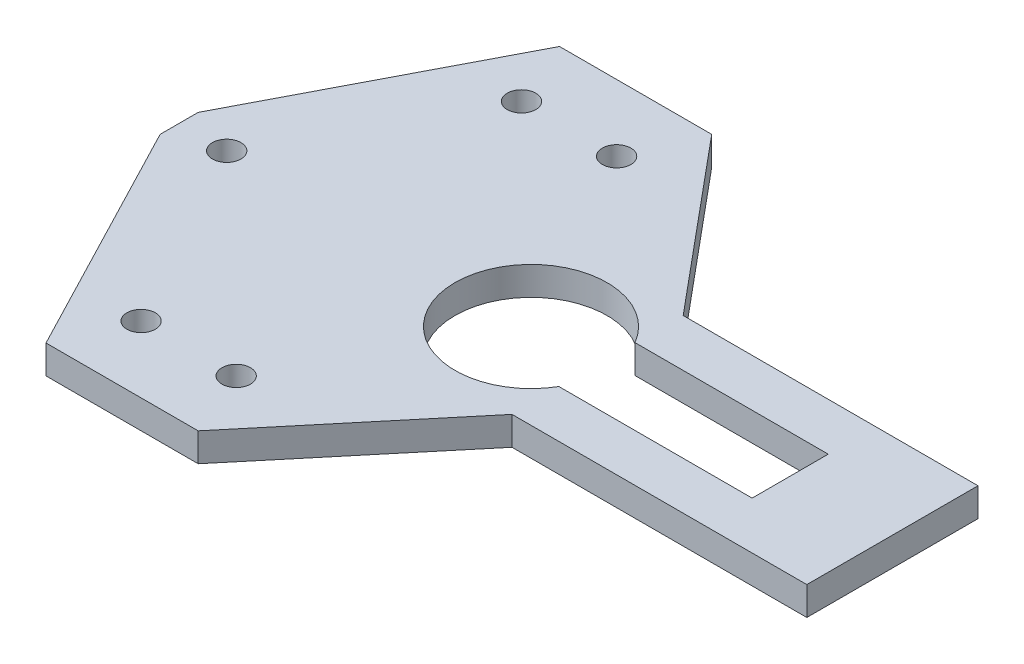
ISO-10303-21;
HEADER;
FILE_DESCRIPTION(('STEP AP214'),'2;1');
FILE_NAME('part.step','',(''),(''),'','','');
FILE_SCHEMA(('AUTOMOTIVE_DESIGN { 1 0 10303 214 1 1 1 1 }'));
ENDSEC;
DATA;
#1=APPLICATION_CONTEXT('core data for automotive mechanical design processes');
#2=APPLICATION_PROTOCOL_DEFINITION('international standard','automotive_design',2000,#1);
#3=PRODUCT_CONTEXT('',#1,'mechanical');
#4=PRODUCT('Part','Part','',(#3));
#5=PRODUCT_RELATED_PRODUCT_CATEGORY('part','',(#4));
#6=PRODUCT_DEFINITION_FORMATION('','',#4);
#7=PRODUCT_DEFINITION_CONTEXT('part definition',#1,'design');
#8=PRODUCT_DEFINITION('design','',#6,#7);
#9=PRODUCT_DEFINITION_SHAPE('','',#8);
#10=(LENGTH_UNIT() NAMED_UNIT(*) SI_UNIT(.MILLI.,.METRE.));
#11=(NAMED_UNIT(*) PLANE_ANGLE_UNIT() SI_UNIT($,.RADIAN.));
#12=(NAMED_UNIT(*) SI_UNIT($,.STERADIAN.) SOLID_ANGLE_UNIT());
#13=UNCERTAINTY_MEASURE_WITH_UNIT(LENGTH_MEASURE(1.E-05),#10,'distance_accuracy_value','');
#14=(GEOMETRIC_REPRESENTATION_CONTEXT(3) GLOBAL_UNCERTAINTY_ASSIGNED_CONTEXT((#13)) GLOBAL_UNIT_ASSIGNED_CONTEXT((#10,
#11,#12)) REPRESENTATION_CONTEXT('',''));
#15=CARTESIAN_POINT('',(0.,0.,0.));
#16=DIRECTION('',(0.,0.,1.));
#17=DIRECTION('',(1.,0.,0.));
#18=AXIS2_PLACEMENT_3D('',#15,#16,#17);
#19=CARTESIAN_POINT('',(0.,3.,0.));
#20=DIRECTION('',(0.,1.,0.));
#21=DIRECTION('',(0.,0.,1.));
#22=AXIS2_PLACEMENT_3D('',#19,#20,#21);
#23=PLANE('',#22);
#24=CARTESIAN_POINT('',(-21.,3.,20.));
#25=DIRECTION('',(0.,1.,0.));
#26=DIRECTION('',(0.,0.,-1.));
#27=AXIS2_PLACEMENT_3D('',#24,#25,#26);
#28=CIRCLE('',#27,1.5);
#29=CARTESIAN_POINT('',(-21.,3.,18.5));
#30=VERTEX_POINT('',#29);
#31=EDGE_CURVE('E533',#30,#30,#28,.T.);
#32=ORIENTED_EDGE('',*,*,#31,.F.);
#33=EDGE_LOOP('',(#32));
#34=FACE_BOUND('',#33,.T.);
#35=CARTESIAN_POINT('',(-11.,3.,-20.));
#36=DIRECTION('',(0.,1.,0.));
#37=DIRECTION('',(0.,0.,1.));
#38=AXIS2_PLACEMENT_3D('',#35,#36,#37);
#39=CIRCLE('',#38,1.5);
#40=CARTESIAN_POINT('',(-11.,3.,-18.5));
#41=VERTEX_POINT('',#40);
#42=EDGE_CURVE('E549',#41,#41,#39,.T.);
#43=ORIENTED_EDGE('',*,*,#42,.F.);
#44=EDGE_LOOP('',(#43));
#45=FACE_BOUND('',#44,.T.);
#46=DIRECTION('',(0.,0.,-1.));
#47=VECTOR('',#46,1.);
#48=CARTESIAN_POINT('',(27.25,3.,-4.));
#49=LINE('',#48,#47);
#50=CARTESIAN_POINT('',(27.25,3.,4.));
#51=VERTEX_POINT('',#50);
#52=CARTESIAN_POINT('',(27.25,3.,-4.));
#53=VERTEX_POINT('',#52);
#54=EDGE_CURVE('E150',#51,#53,#49,.T.);
#55=ORIENTED_EDGE('',*,*,#54,.F.);
#56=DIRECTION('',(1.,0.,0.));
#57=VECTOR('',#56,1.);
#58=CARTESIAN_POINT('',(6.92820323027551,3.,4.));
#59=LINE('',#58,#57);
#60=CARTESIAN_POINT('',(6.92820323027551,3.,4.));
#61=VERTEX_POINT('',#60);
#62=EDGE_CURVE('E141',#61,#51,#59,.T.);
#63=ORIENTED_EDGE('',*,*,#62,.F.);
#64=CARTESIAN_POINT('',(0.,3.,0.));
#65=DIRECTION('',(0.,1.,0.));
#66=DIRECTION('',(0.,0.,1.));
#67=AXIS2_PLACEMENT_3D('',#64,#65,#66);
#68=CIRCLE('',#67,8.);
#69=CARTESIAN_POINT('',(6.92820323027551,3.,-4.));
#70=VERTEX_POINT('',#69);
#71=EDGE_CURVE('E168',#70,#61,#68,.T.);
#72=ORIENTED_EDGE('',*,*,#71,.F.);
#73=DIRECTION('',(-1.,0.,0.));
#74=VECTOR('',#73,1.);
#75=CARTESIAN_POINT('',(6.92820323027551,3.,-4.));
#76=LINE('',#75,#74);
#77=EDGE_CURVE('E164',#53,#70,#76,.T.);
#78=ORIENTED_EDGE('',*,*,#77,.F.);
#79=EDGE_LOOP('',(#55,#63,#72,#78));
#80=FACE_BOUND('',#79,.T.);
#81=DIRECTION('',(-1.,0.,0.));
#82=VECTOR('',#81,1.);
#83=CARTESIAN_POINT('',(38.,3.,-9.));
#84=LINE('',#83,#82);
#85=CARTESIAN_POINT('',(38.,3.,-9.));
#86=VERTEX_POINT('',#85);
#87=CARTESIAN_POINT('',(7.,3.,-9.));
#88=VERTEX_POINT('',#87);
#89=EDGE_CURVE('E192',#86,#88,#84,.T.);
#90=ORIENTED_EDGE('',*,*,#89,.T.);
#91=DIRECTION('',(-0.64018439966448,0.,-0.768221279597376));
#92=VECTOR('',#91,1.);
#93=CARTESIAN_POINT('',(7.,3.,-9.));
#94=LINE('',#93,#92);
#95=CARTESIAN_POINT('',(-8.,3.,-27.));
#96=VERTEX_POINT('',#95);
#97=EDGE_CURVE('E196',#88,#96,#94,.T.);
#98=ORIENTED_EDGE('',*,*,#97,.T.);
#99=DIRECTION('',(-1.,0.,0.));
#100=VECTOR('',#99,1.);
#101=CARTESIAN_POINT('',(-8.,3.,-27.));
#102=LINE('',#101,#100);
#103=CARTESIAN_POINT('',(-24.,3.,-27.));
#104=VERTEX_POINT('',#103);
#105=EDGE_CURVE('E200',#96,#104,#102,.T.);
#106=ORIENTED_EDGE('',*,*,#105,.T.);
#107=DIRECTION('',(-0.461352736641989,0.,0.887216801234595));
#108=VECTOR('',#107,1.);
#109=CARTESIAN_POINT('',(-24.,3.,-27.));
#110=LINE('',#109,#108);
#111=CARTESIAN_POINT('',(-37.,3.,-2.));
#112=VERTEX_POINT('',#111);
#113=EDGE_CURVE('E203',#104,#112,#110,.T.);
#114=ORIENTED_EDGE('',*,*,#113,.T.);
#115=DIRECTION('',(0.,0.,1.));
#116=VECTOR('',#115,1.);
#117=CARTESIAN_POINT('',(-37.,3.,-2.));
#118=LINE('',#117,#116);
#119=CARTESIAN_POINT('',(-37.,3.,2.));
#120=VERTEX_POINT('',#119);
#121=EDGE_CURVE('E206',#112,#120,#118,.T.);
#122=ORIENTED_EDGE('',*,*,#121,.T.);
#123=DIRECTION('',(0.461352736641989,0.,0.887216801234595));
#124=VECTOR('',#123,1.);
#125=CARTESIAN_POINT('',(-24.,3.,27.));
#126=LINE('',#125,#124);
#127=CARTESIAN_POINT('',(-24.,3.,27.));
#128=VERTEX_POINT('',#127);
#129=EDGE_CURVE('E209',#120,#128,#126,.T.);
#130=ORIENTED_EDGE('',*,*,#129,.T.);
#131=DIRECTION('',(1.,0.,0.));
#132=VECTOR('',#131,1.);
#133=CARTESIAN_POINT('',(-8.,3.,27.));
#134=LINE('',#133,#132);
#135=CARTESIAN_POINT('',(-8.,3.,27.));
#136=VERTEX_POINT('',#135);
#137=EDGE_CURVE('E212',#128,#136,#134,.T.);
#138=ORIENTED_EDGE('',*,*,#137,.T.);
#139=DIRECTION('',(0.64018439966448,0.,-0.768221279597376));
#140=VECTOR('',#139,1.);
#141=CARTESIAN_POINT('',(7.,3.,9.));
#142=LINE('',#141,#140);
#143=CARTESIAN_POINT('',(7.,3.,9.));
#144=VERTEX_POINT('',#143);
#145=EDGE_CURVE('E215',#136,#144,#142,.T.);
#146=ORIENTED_EDGE('',*,*,#145,.T.);
#147=DIRECTION('',(1.,0.,0.));
#148=VECTOR('',#147,1.);
#149=CARTESIAN_POINT('',(38.,3.,9.));
#150=LINE('',#149,#148);
#151=CARTESIAN_POINT('',(38.,3.,9.));
#152=VERTEX_POINT('',#151);
#153=EDGE_CURVE('E218',#144,#152,#150,.T.);
#154=ORIENTED_EDGE('',*,*,#153,.T.);
#155=DIRECTION('',(0.,0.,-1.));
#156=VECTOR('',#155,1.);
#157=CARTESIAN_POINT('',(38.,3.,9.));
#158=LINE('',#157,#156);
#159=EDGE_CURVE('E221',#152,#86,#158,.T.);
#160=ORIENTED_EDGE('',*,*,#159,.T.);
#161=EDGE_LOOP('',(#90,#98,#106,#114,#122,#130,#138,#146,#154,#160));
#162=FACE_BOUND('',#161,.T.);
#163=CARTESIAN_POINT('',(-21.,3.,-20.));
#164=DIRECTION('',(0.,1.,0.));
#165=DIRECTION('',(0.,0.,1.));
#166=AXIS2_PLACEMENT_3D('',#163,#164,#165);
#167=CIRCLE('',#166,1.5);
#168=CARTESIAN_POINT('',(-21.,3.,-18.5));
#169=VERTEX_POINT('',#168);
#170=EDGE_CURVE('E176',#169,#169,#167,.T.);
#171=ORIENTED_EDGE('',*,*,#170,.F.);
#172=EDGE_LOOP('',(#171));
#173=FACE_BOUND('',#172,.T.);
#174=CARTESIAN_POINT('',(-11.,3.,20.));
#175=DIRECTION('',(0.,1.,0.));
#176=DIRECTION('',(0.,0.,-1.));
#177=AXIS2_PLACEMENT_3D('',#174,#175,#176);
#178=CIRCLE('',#177,1.5);
#179=CARTESIAN_POINT('',(-11.,3.,18.5));
#180=VERTEX_POINT('',#179);
#181=EDGE_CURVE('E541',#180,#180,#178,.T.);
#182=ORIENTED_EDGE('',*,*,#181,.F.);
#183=EDGE_LOOP('',(#182));
#184=FACE_BOUND('',#183,.T.);
#185=CARTESIAN_POINT('',(-32.,3.,0.));
#186=DIRECTION('',(0.,1.,0.));
#187=DIRECTION('',(0.,0.,1.));
#188=AXIS2_PLACEMENT_3D('',#185,#186,#187);
#189=CIRCLE('',#188,1.5);
#190=CARTESIAN_POINT('',(-32.,3.,1.5));
#191=VERTEX_POINT('',#190);
#192=EDGE_CURVE('E522',#191,#191,#189,.T.);
#193=ORIENTED_EDGE('',*,*,#192,.F.);
#194=EDGE_LOOP('',(#193));
#195=FACE_BOUND('',#194,.T.);
#196=ADVANCED_FACE('F39',(#34,#45,#80,#162,#173,#184,#195),#23,.T.);
#197=CARTESIAN_POINT('',(0.,0.,0.));
#198=DIRECTION('',(0.,1.,0.));
#199=DIRECTION('',(0.,0.,1.));
#200=AXIS2_PLACEMENT_3D('',#197,#198,#199);
#201=PLANE('',#200);
#202=DIRECTION('',(-1.,0.,0.));
#203=VECTOR('',#202,1.);
#204=CARTESIAN_POINT('',(38.,0.,-9.));
#205=LINE('',#204,#203);
#206=CARTESIAN_POINT('',(38.,0.,-9.));
#207=VERTEX_POINT('',#206);
#208=CARTESIAN_POINT('',(7.,0.,-9.));
#209=VERTEX_POINT('',#208);
#210=EDGE_CURVE('E159',#207,#209,#205,.T.);
#211=ORIENTED_EDGE('',*,*,#210,.F.);
#212=DIRECTION('',(0.,0.,-1.));
#213=VECTOR('',#212,1.);
#214=CARTESIAN_POINT('',(38.,0.,9.));
#215=LINE('',#214,#213);
#216=CARTESIAN_POINT('',(38.,0.,9.));
#217=VERTEX_POINT('',#216);
#218=EDGE_CURVE('E197',#217,#207,#215,.T.);
#219=ORIENTED_EDGE('',*,*,#218,.F.);
#220=DIRECTION('',(1.,0.,0.));
#221=VECTOR('',#220,1.);
#222=CARTESIAN_POINT('',(38.,0.,9.));
#223=LINE('',#222,#221);
#224=CARTESIAN_POINT('',(7.,0.,9.));
#225=VERTEX_POINT('',#224);
#226=EDGE_CURVE('E249',#225,#217,#223,.T.);
#227=ORIENTED_EDGE('',*,*,#226,.F.);
#228=DIRECTION('',(0.64018439966448,0.,-0.768221279597376));
#229=VECTOR('',#228,1.);
#230=CARTESIAN_POINT('',(7.,0.,9.));
#231=LINE('',#230,#229);
#232=CARTESIAN_POINT('',(-8.,0.,27.));
#233=VERTEX_POINT('',#232);
#234=EDGE_CURVE('E246',#233,#225,#231,.T.);
#235=ORIENTED_EDGE('',*,*,#234,.F.);
#236=DIRECTION('',(1.,0.,0.));
#237=VECTOR('',#236,1.);
#238=CARTESIAN_POINT('',(-8.,0.,27.));
#239=LINE('',#238,#237);
#240=CARTESIAN_POINT('',(-24.,0.,27.));
#241=VERTEX_POINT('',#240);
#242=EDGE_CURVE('E243',#241,#233,#239,.T.);
#243=ORIENTED_EDGE('',*,*,#242,.F.);
#244=DIRECTION('',(0.461352736641989,0.,0.887216801234595));
#245=VECTOR('',#244,1.);
#246=CARTESIAN_POINT('',(-24.,0.,27.));
#247=LINE('',#246,#245);
#248=CARTESIAN_POINT('',(-37.,0.,2.));
#249=VERTEX_POINT('',#248);
#250=EDGE_CURVE('E240',#249,#241,#247,.T.);
#251=ORIENTED_EDGE('',*,*,#250,.F.);
#252=DIRECTION('',(0.,0.,1.));
#253=VECTOR('',#252,1.);
#254=CARTESIAN_POINT('',(-37.,0.,-2.));
#255=LINE('',#254,#253);
#256=CARTESIAN_POINT('',(-37.,0.,-2.));
#257=VERTEX_POINT('',#256);
#258=EDGE_CURVE('E237',#257,#249,#255,.T.);
#259=ORIENTED_EDGE('',*,*,#258,.F.);
#260=DIRECTION('',(-0.461352736641989,0.,0.887216801234595));
#261=VECTOR('',#260,1.);
#262=CARTESIAN_POINT('',(-24.,0.,-27.));
#263=LINE('',#262,#261);
#264=CARTESIAN_POINT('',(-24.,0.,-27.));
#265=VERTEX_POINT('',#264);
#266=EDGE_CURVE('E234',#265,#257,#263,.T.);
#267=ORIENTED_EDGE('',*,*,#266,.F.);
#268=DIRECTION('',(-1.,0.,0.));
#269=VECTOR('',#268,1.);
#270=CARTESIAN_POINT('',(-8.,0.,-27.));
#271=LINE('',#270,#269);
#272=CARTESIAN_POINT('',(-8.,0.,-27.));
#273=VERTEX_POINT('',#272);
#274=EDGE_CURVE('E231',#273,#265,#271,.T.);
#275=ORIENTED_EDGE('',*,*,#274,.F.);
#276=DIRECTION('',(-0.64018439966448,0.,-0.768221279597376));
#277=VECTOR('',#276,1.);
#278=CARTESIAN_POINT('',(7.,0.,-9.));
#279=LINE('',#278,#277);
#280=EDGE_CURVE('E228',#209,#273,#279,.T.);
#281=ORIENTED_EDGE('',*,*,#280,.F.);
#282=EDGE_LOOP('',(#211,#219,#227,#235,#243,#251,#259,#267,#275,#281));
#283=FACE_BOUND('',#282,.T.);
#284=DIRECTION('',(1.,0.,0.));
#285=VECTOR('',#284,1.);
#286=CARTESIAN_POINT('',(6.92820323027551,0.,4.));
#287=LINE('',#286,#285);
#288=CARTESIAN_POINT('',(6.92820323027551,0.,4.));
#289=VERTEX_POINT('',#288);
#290=CARTESIAN_POINT('',(27.25,0.,4.));
#291=VERTEX_POINT('',#290);
#292=EDGE_CURVE('E63',#289,#291,#287,.T.);
#293=ORIENTED_EDGE('',*,*,#292,.T.);
#294=DIRECTION('',(0.,0.,-1.));
#295=VECTOR('',#294,1.);
#296=CARTESIAN_POINT('',(27.25,0.,-4.));
#297=LINE('',#296,#295);
#298=CARTESIAN_POINT('',(27.25,0.,-4.));
#299=VERTEX_POINT('',#298);
#300=EDGE_CURVE('E157',#291,#299,#297,.T.);
#301=ORIENTED_EDGE('',*,*,#300,.T.);
#302=DIRECTION('',(-1.,0.,0.));
#303=VECTOR('',#302,1.);
#304=CARTESIAN_POINT('',(6.92820323027551,0.,-4.));
#305=LINE('',#304,#303);
#306=CARTESIAN_POINT('',(6.92820323027551,0.,-4.));
#307=VERTEX_POINT('',#306);
#308=EDGE_CURVE('E179',#299,#307,#305,.T.);
#309=ORIENTED_EDGE('',*,*,#308,.T.);
#310=CARTESIAN_POINT('',(0.,0.,0.));
#311=DIRECTION('',(0.,1.,0.));
#312=DIRECTION('',(0.,0.,1.));
#313=AXIS2_PLACEMENT_3D('',#310,#311,#312);
#314=CIRCLE('',#313,8.);
#315=EDGE_CURVE('E151',#307,#289,#314,.T.);
#316=ORIENTED_EDGE('',*,*,#315,.T.);
#317=EDGE_LOOP('',(#293,#301,#309,#316));
#318=FACE_BOUND('',#317,.T.);
#319=CARTESIAN_POINT('',(-21.,0.,-20.));
#320=DIRECTION('',(0.,1.,0.));
#321=DIRECTION('',(0.,0.,1.));
#322=AXIS2_PLACEMENT_3D('',#319,#320,#321);
#323=CIRCLE('',#322,1.5);
#324=CARTESIAN_POINT('',(-21.,0.,-18.5));
#325=VERTEX_POINT('',#324);
#326=EDGE_CURVE('E553',#325,#325,#323,.T.);
#327=ORIENTED_EDGE('',*,*,#326,.T.);
#328=EDGE_LOOP('',(#327));
#329=FACE_BOUND('',#328,.T.);
#330=CARTESIAN_POINT('',(-11.,0.,-20.));
#331=DIRECTION('',(0.,1.,0.));
#332=DIRECTION('',(0.,0.,1.));
#333=AXIS2_PLACEMENT_3D('',#330,#331,#332);
#334=CIRCLE('',#333,1.5);
#335=CARTESIAN_POINT('',(-11.,0.,-18.5));
#336=VERTEX_POINT('',#335);
#337=EDGE_CURVE('E545',#336,#336,#334,.T.);
#338=ORIENTED_EDGE('',*,*,#337,.T.);
#339=EDGE_LOOP('',(#338));
#340=FACE_BOUND('',#339,.T.);
#341=CARTESIAN_POINT('',(-11.,0.,20.));
#342=DIRECTION('',(0.,1.,0.));
#343=DIRECTION('',(0.,0.,-1.));
#344=AXIS2_PLACEMENT_3D('',#341,#342,#343);
#345=CIRCLE('',#344,1.5);
#346=CARTESIAN_POINT('',(-11.,0.,18.5));
#347=VERTEX_POINT('',#346);
#348=EDGE_CURVE('E537',#347,#347,#345,.T.);
#349=ORIENTED_EDGE('',*,*,#348,.T.);
#350=EDGE_LOOP('',(#349));
#351=FACE_BOUND('',#350,.T.);
#352=CARTESIAN_POINT('',(-21.,0.,20.));
#353=DIRECTION('',(0.,1.,0.));
#354=DIRECTION('',(0.,0.,-1.));
#355=AXIS2_PLACEMENT_3D('',#352,#353,#354);
#356=CIRCLE('',#355,1.5);
#357=CARTESIAN_POINT('',(-21.,0.,18.5));
#358=VERTEX_POINT('',#357);
#359=EDGE_CURVE('E530',#358,#358,#356,.T.);
#360=ORIENTED_EDGE('',*,*,#359,.T.);
#361=EDGE_LOOP('',(#360));
#362=FACE_BOUND('',#361,.T.);
#363=CARTESIAN_POINT('',(-32.,0.,0.));
#364=DIRECTION('',(0.,1.,0.));
#365=DIRECTION('',(0.,0.,1.));
#366=AXIS2_PLACEMENT_3D('',#363,#364,#365);
#367=CIRCLE('',#366,1.5);
#368=CARTESIAN_POINT('',(-32.,0.,1.5));
#369=VERTEX_POINT('',#368);
#370=EDGE_CURVE('E525',#369,#369,#367,.T.);
#371=ORIENTED_EDGE('',*,*,#370,.T.);
#372=EDGE_LOOP('',(#371));
#373=FACE_BOUND('',#372,.T.);
#374=ADVANCED_FACE('F296',(#283,#318,#329,#340,#351,#362,#373),#201,.F.);
#375=CARTESIAN_POINT('',(38.,3.,-9.));
#376=DIRECTION('',(0.,0.,1.));
#377=DIRECTION('',(1.,0.,0.));
#378=AXIS2_PLACEMENT_3D('',#375,#376,#377);
#379=PLANE('',#378);
#380=ORIENTED_EDGE('',*,*,#210,.T.);
#381=DIRECTION('',(0.,-1.,0.));
#382=VECTOR('',#381,1.);
#383=CARTESIAN_POINT('',(7.,3.,-9.));
#384=LINE('',#383,#382);
#385=EDGE_CURVE('E11',#88,#209,#384,.T.);
#386=ORIENTED_EDGE('',*,*,#385,.F.);
#387=ORIENTED_EDGE('',*,*,#89,.F.);
#388=DIRECTION('',(0.,-1.,0.));
#389=VECTOR('',#388,1.);
#390=CARTESIAN_POINT('',(38.,3.,-9.));
#391=LINE('',#390,#389);
#392=EDGE_CURVE('E224',#86,#207,#391,.T.);
#393=ORIENTED_EDGE('',*,*,#392,.T.);
#394=EDGE_LOOP('',(#380,#386,#387,#393));
#395=FACE_BOUND('',#394,.T.);
#396=ADVANCED_FACE('F41',(#395),#379,.F.);
#397=CARTESIAN_POINT('',(7.,3.,-9.));
#398=DIRECTION('',(-0.768221279597376,0.,0.64018439966448));
#399=DIRECTION('',(0.64018439966448,0.,0.768221279597376));
#400=AXIS2_PLACEMENT_3D('',#397,#398,#399);
#401=PLANE('',#400);
#402=ORIENTED_EDGE('',*,*,#280,.T.);
#403=DIRECTION('',(0.,-1.,0.));
#404=VECTOR('',#403,1.);
#405=CARTESIAN_POINT('',(-8.,3.,-27.));
#406=LINE('',#405,#404);
#407=EDGE_CURVE('E48',#96,#273,#406,.T.);
#408=ORIENTED_EDGE('',*,*,#407,.F.);
#409=ORIENTED_EDGE('',*,*,#97,.F.);
#410=ORIENTED_EDGE('',*,*,#385,.T.);
#411=EDGE_LOOP('',(#402,#408,#409,#410));
#412=FACE_BOUND('',#411,.T.);
#413=ADVANCED_FACE('F313',(#412),#401,.F.);
#414=CARTESIAN_POINT('',(-8.,3.,-27.));
#415=DIRECTION('',(0.,0.,1.));
#416=DIRECTION('',(1.,0.,0.));
#417=AXIS2_PLACEMENT_3D('',#414,#415,#416);
#418=PLANE('',#417);
#419=ORIENTED_EDGE('',*,*,#274,.T.);
#420=DIRECTION('',(0.,-1.,0.));
#421=VECTOR('',#420,1.);
#422=CARTESIAN_POINT('',(-24.,3.,-27.));
#423=LINE('',#422,#421);
#424=EDGE_CURVE('E281',#104,#265,#423,.T.);
#425=ORIENTED_EDGE('',*,*,#424,.F.);
#426=ORIENTED_EDGE('',*,*,#105,.F.);
#427=ORIENTED_EDGE('',*,*,#407,.T.);
#428=EDGE_LOOP('',(#419,#425,#426,#427));
#429=FACE_BOUND('',#428,.T.);
#430=ADVANCED_FACE('F290',(#429),#418,.F.);
#431=CARTESIAN_POINT('',(-24.,3.,-27.));
#432=DIRECTION('',(0.887216801234595,0.,0.461352736641989));
#433=DIRECTION('',(0.461352736641989,0.,-0.887216801234595));
#434=AXIS2_PLACEMENT_3D('',#431,#432,#433);
#435=PLANE('',#434);
#436=ORIENTED_EDGE('',*,*,#266,.T.);
#437=DIRECTION('',(0.,-1.,0.));
#438=VECTOR('',#437,1.);
#439=CARTESIAN_POINT('',(-37.,3.,-2.));
#440=LINE('',#439,#438);
#441=EDGE_CURVE('E277',#112,#257,#440,.T.);
#442=ORIENTED_EDGE('',*,*,#441,.F.);
#443=ORIENTED_EDGE('',*,*,#113,.F.);
#444=ORIENTED_EDGE('',*,*,#424,.T.);
#445=EDGE_LOOP('',(#436,#442,#443,#444));
#446=FACE_BOUND('',#445,.T.);
#447=ADVANCED_FACE('F302',(#446),#435,.F.);
#448=CARTESIAN_POINT('',(-37.,3.,-2.));
#449=DIRECTION('',(1.,0.,0.));
#450=DIRECTION('',(0.,0.,-1.));
#451=AXIS2_PLACEMENT_3D('',#448,#449,#450);
#452=PLANE('',#451);
#453=ORIENTED_EDGE('',*,*,#258,.T.);
#454=DIRECTION('',(0.,-1.,0.));
#455=VECTOR('',#454,1.);
#456=CARTESIAN_POINT('',(-37.,3.,2.));
#457=LINE('',#456,#455);
#458=EDGE_CURVE('E273',#120,#249,#457,.T.);
#459=ORIENTED_EDGE('',*,*,#458,.F.);
#460=ORIENTED_EDGE('',*,*,#121,.F.);
#461=ORIENTED_EDGE('',*,*,#441,.T.);
#462=EDGE_LOOP('',(#453,#459,#460,#461));
#463=FACE_BOUND('',#462,.T.);
#464=ADVANCED_FACE('F306',(#463),#452,.F.);
#465=CARTESIAN_POINT('',(-24.,3.,27.));
#466=DIRECTION('',(0.887216801234595,0.,-0.461352736641989));
#467=DIRECTION('',(-0.461352736641989,0.,-0.887216801234595));
#468=AXIS2_PLACEMENT_3D('',#465,#466,#467);
#469=PLANE('',#468);
#470=ORIENTED_EDGE('',*,*,#250,.T.);
#471=DIRECTION('',(0.,-1.,0.));
#472=VECTOR('',#471,1.);
#473=CARTESIAN_POINT('',(-24.,3.,27.));
#474=LINE('',#473,#472);
#475=EDGE_CURVE('E269',#128,#241,#474,.T.);
#476=ORIENTED_EDGE('',*,*,#475,.F.);
#477=ORIENTED_EDGE('',*,*,#129,.F.);
#478=ORIENTED_EDGE('',*,*,#458,.T.);
#479=EDGE_LOOP('',(#470,#476,#477,#478));
#480=FACE_BOUND('',#479,.T.);
#481=ADVANCED_FACE('F336',(#480),#469,.F.);
#482=CARTESIAN_POINT('',(-8.,3.,27.));
#483=DIRECTION('',(0.,0.,-1.));
#484=DIRECTION('',(-1.,0.,0.));
#485=AXIS2_PLACEMENT_3D('',#482,#483,#484);
#486=PLANE('',#485);
#487=ORIENTED_EDGE('',*,*,#242,.T.);
#488=DIRECTION('',(0.,-1.,0.));
#489=VECTOR('',#488,1.);
#490=CARTESIAN_POINT('',(-8.,3.,27.));
#491=LINE('',#490,#489);
#492=EDGE_CURVE('E265',#136,#233,#491,.T.);
#493=ORIENTED_EDGE('',*,*,#492,.F.);
#494=ORIENTED_EDGE('',*,*,#137,.F.);
#495=ORIENTED_EDGE('',*,*,#475,.T.);
#496=EDGE_LOOP('',(#487,#493,#494,#495));
#497=FACE_BOUND('',#496,.T.);
#498=ADVANCED_FACE('F333',(#497),#486,.F.);
#499=CARTESIAN_POINT('',(7.,3.,9.));
#500=DIRECTION('',(-0.768221279597376,0.,-0.64018439966448));
#501=DIRECTION('',(-0.64018439966448,0.,0.768221279597376));
#502=AXIS2_PLACEMENT_3D('',#499,#500,#501);
#503=PLANE('',#502);
#504=ORIENTED_EDGE('',*,*,#234,.T.);
#505=DIRECTION('',(0.,-1.,0.));
#506=VECTOR('',#505,1.);
#507=CARTESIAN_POINT('',(7.,3.,9.));
#508=LINE('',#507,#506);
#509=EDGE_CURVE('E261',#144,#225,#508,.T.);
#510=ORIENTED_EDGE('',*,*,#509,.F.);
#511=ORIENTED_EDGE('',*,*,#145,.F.);
#512=ORIENTED_EDGE('',*,*,#492,.T.);
#513=EDGE_LOOP('',(#504,#510,#511,#512));
#514=FACE_BOUND('',#513,.T.);
#515=ADVANCED_FACE('F329',(#514),#503,.F.);
#516=CARTESIAN_POINT('',(38.,3.,9.));
#517=DIRECTION('',(0.,0.,-1.));
#518=DIRECTION('',(-1.,0.,0.));
#519=AXIS2_PLACEMENT_3D('',#516,#517,#518);
#520=PLANE('',#519);
#521=ORIENTED_EDGE('',*,*,#226,.T.);
#522=DIRECTION('',(0.,-1.,0.));
#523=VECTOR('',#522,1.);
#524=CARTESIAN_POINT('',(38.,3.,9.));
#525=LINE('',#524,#523);
#526=EDGE_CURVE('E257',#152,#217,#525,.T.);
#527=ORIENTED_EDGE('',*,*,#526,.F.);
#528=ORIENTED_EDGE('',*,*,#153,.F.);
#529=ORIENTED_EDGE('',*,*,#509,.T.);
#530=EDGE_LOOP('',(#521,#527,#528,#529));
#531=FACE_BOUND('',#530,.T.);
#532=ADVANCED_FACE('F325',(#531),#520,.F.);
#533=CARTESIAN_POINT('',(38.,3.,9.));
#534=DIRECTION('',(-1.,0.,0.));
#535=DIRECTION('',(0.,0.,1.));
#536=AXIS2_PLACEMENT_3D('',#533,#534,#535);
#537=PLANE('',#536);
#538=ORIENTED_EDGE('',*,*,#218,.T.);
#539=ORIENTED_EDGE('',*,*,#392,.F.);
#540=ORIENTED_EDGE('',*,*,#159,.F.);
#541=ORIENTED_EDGE('',*,*,#526,.T.);
#542=EDGE_LOOP('',(#538,#539,#540,#541));
#543=FACE_BOUND('',#542,.T.);
#544=ADVANCED_FACE('F320',(#543),#537,.F.);
#545=CARTESIAN_POINT('',(6.92820323027551,3.,4.));
#546=DIRECTION('',(0.,0.,-1.));
#547=DIRECTION('',(-1.,0.,0.));
#548=AXIS2_PLACEMENT_3D('',#545,#546,#547);
#549=PLANE('',#548);
#550=ORIENTED_EDGE('',*,*,#292,.F.);
#551=DIRECTION('',(0.,-1.,0.));
#552=VECTOR('',#551,1.);
#553=CARTESIAN_POINT('',(6.92820323027551,3.,4.));
#554=LINE('',#553,#552);
#555=EDGE_CURVE('E145',#61,#289,#554,.T.);
#556=ORIENTED_EDGE('',*,*,#555,.F.);
#557=ORIENTED_EDGE('',*,*,#62,.T.);
#558=DIRECTION('',(0.,-1.,0.));
#559=VECTOR('',#558,1.);
#560=CARTESIAN_POINT('',(27.25,3.,4.));
#561=LINE('',#560,#559);
#562=EDGE_CURVE('E144',#51,#291,#561,.T.);
#563=ORIENTED_EDGE('',*,*,#562,.T.);
#564=EDGE_LOOP('',(#550,#556,#557,#563));
#565=FACE_BOUND('',#564,.T.);
#566=ADVANCED_FACE('F143',(#565),#549,.T.);
#567=CARTESIAN_POINT('',(27.25,3.,-4.));
#568=DIRECTION('',(-1.,0.,0.));
#569=DIRECTION('',(0.,0.,1.));
#570=AXIS2_PLACEMENT_3D('',#567,#568,#569);
#571=PLANE('',#570);
#572=ORIENTED_EDGE('',*,*,#300,.F.);
#573=ORIENTED_EDGE('',*,*,#562,.F.);
#574=ORIENTED_EDGE('',*,*,#54,.T.);
#575=DIRECTION('',(0.,-1.,0.));
#576=VECTOR('',#575,1.);
#577=CARTESIAN_POINT('',(27.25,3.,-4.));
#578=LINE('',#577,#576);
#579=EDGE_CURVE('E160',#53,#299,#578,.T.);
#580=ORIENTED_EDGE('',*,*,#579,.T.);
#581=EDGE_LOOP('',(#572,#573,#574,#580));
#582=FACE_BOUND('',#581,.T.);
#583=ADVANCED_FACE('F154',(#582),#571,.T.);
#584=CARTESIAN_POINT('',(6.92820323027551,3.,-4.));
#585=DIRECTION('',(0.,0.,1.));
#586=DIRECTION('',(1.,0.,0.));
#587=AXIS2_PLACEMENT_3D('',#584,#585,#586);
#588=PLANE('',#587);
#589=ORIENTED_EDGE('',*,*,#308,.F.);
#590=ORIENTED_EDGE('',*,*,#579,.F.);
#591=ORIENTED_EDGE('',*,*,#77,.T.);
#592=DIRECTION('',(0.,-1.,0.));
#593=VECTOR('',#592,1.);
#594=CARTESIAN_POINT('',(6.92820323027551,3.,-4.));
#595=LINE('',#594,#593);
#596=EDGE_CURVE('E55',#70,#307,#595,.T.);
#597=ORIENTED_EDGE('',*,*,#596,.T.);
#598=EDGE_LOOP('',(#589,#590,#591,#597));
#599=FACE_BOUND('',#598,.T.);
#600=ADVANCED_FACE('F385',(#599),#588,.T.);
#601=CARTESIAN_POINT('',(0.,3.,0.));
#602=DIRECTION('',(0.,-1.,0.));
#603=DIRECTION('',(0.,0.,-1.));
#604=AXIS2_PLACEMENT_3D('',#601,#602,#603);
#605=CYLINDRICAL_SURFACE('',#604,8.);
#606=ORIENTED_EDGE('',*,*,#315,.F.);
#607=ORIENTED_EDGE('',*,*,#596,.F.);
#608=ORIENTED_EDGE('',*,*,#71,.T.);
#609=ORIENTED_EDGE('',*,*,#555,.T.);
#610=EDGE_LOOP('',(#606,#607,#608,#609));
#611=FACE_BOUND('',#610,.T.);
#612=ADVANCED_FACE('F391',(#611),#605,.F.);
#613=CARTESIAN_POINT('',(-21.,3.,-20.));
#614=DIRECTION('',(0.,-1.,0.));
#615=DIRECTION('',(0.,0.,-1.));
#616=AXIS2_PLACEMENT_3D('',#613,#614,#615);
#617=CYLINDRICAL_SURFACE('',#616,1.5);
#618=ORIENTED_EDGE('',*,*,#170,.T.);
#619=EDGE_LOOP('',(#618));
#620=FACE_BOUND('',#619,.T.);
#621=ORIENTED_EDGE('',*,*,#326,.F.);
#622=EDGE_LOOP('',(#621));
#623=FACE_BOUND('',#622,.T.);
#624=ADVANCED_FACE('F399',(#620,#623),#617,.F.);
#625=CARTESIAN_POINT('',(-11.,3.,-20.));
#626=DIRECTION('',(0.,-1.,0.));
#627=DIRECTION('',(0.,0.,-1.));
#628=AXIS2_PLACEMENT_3D('',#625,#626,#627);
#629=CYLINDRICAL_SURFACE('',#628,1.5);
#630=ORIENTED_EDGE('',*,*,#42,.T.);
#631=EDGE_LOOP('',(#630));
#632=FACE_BOUND('',#631,.T.);
#633=ORIENTED_EDGE('',*,*,#337,.F.);
#634=EDGE_LOOP('',(#633));
#635=FACE_BOUND('',#634,.T.);
#636=ADVANCED_FACE('F406',(#632,#635),#629,.F.);
#637=CARTESIAN_POINT('',(-11.,3.,20.));
#638=DIRECTION('',(0.,-1.,0.));
#639=DIRECTION('',(0.,0.,-1.));
#640=AXIS2_PLACEMENT_3D('',#637,#638,#639);
#641=CYLINDRICAL_SURFACE('',#640,1.5);
#642=ORIENTED_EDGE('',*,*,#181,.T.);
#643=EDGE_LOOP('',(#642));
#644=FACE_BOUND('',#643,.T.);
#645=ORIENTED_EDGE('',*,*,#348,.F.);
#646=EDGE_LOOP('',(#645));
#647=FACE_BOUND('',#646,.T.);
#648=ADVANCED_FACE('F414',(#644,#647),#641,.F.);
#649=CARTESIAN_POINT('',(-21.,3.,20.));
#650=DIRECTION('',(0.,-1.,0.));
#651=DIRECTION('',(0.,0.,-1.));
#652=AXIS2_PLACEMENT_3D('',#649,#650,#651);
#653=CYLINDRICAL_SURFACE('',#652,1.5);
#654=ORIENTED_EDGE('',*,*,#31,.T.);
#655=EDGE_LOOP('',(#654));
#656=FACE_BOUND('',#655,.T.);
#657=ORIENTED_EDGE('',*,*,#359,.F.);
#658=EDGE_LOOP('',(#657));
#659=FACE_BOUND('',#658,.T.);
#660=ADVANCED_FACE('F422',(#656,#659),#653,.F.);
#661=CARTESIAN_POINT('',(-32.,3.,0.));
#662=DIRECTION('',(0.,-1.,0.));
#663=DIRECTION('',(0.,0.,-1.));
#664=AXIS2_PLACEMENT_3D('',#661,#662,#663);
#665=CYLINDRICAL_SURFACE('',#664,1.5);
#666=ORIENTED_EDGE('',*,*,#192,.T.);
#667=EDGE_LOOP('',(#666));
#668=FACE_BOUND('',#667,.T.);
#669=ORIENTED_EDGE('',*,*,#370,.F.);
#670=EDGE_LOOP('',(#669));
#671=FACE_BOUND('',#670,.T.);
#672=ADVANCED_FACE('F430',(#668,#671),#665,.F.);
#673=CLOSED_SHELL('',(#196,#374,#396,#413,#430,#447,#464,#481,#498,#515,#532,#544,#566,#583,
#600,#612,#624,#636,#648,#660,#672));
#674=MANIFOLD_SOLID_BREP('B2',#673);
#675=ADVANCED_BREP_SHAPE_REPRESENTATION('',(#18,#674),#14);
#676=SHAPE_DEFINITION_REPRESENTATION(#9,#675);
ENDSEC;
END-ISO-10303-21;
